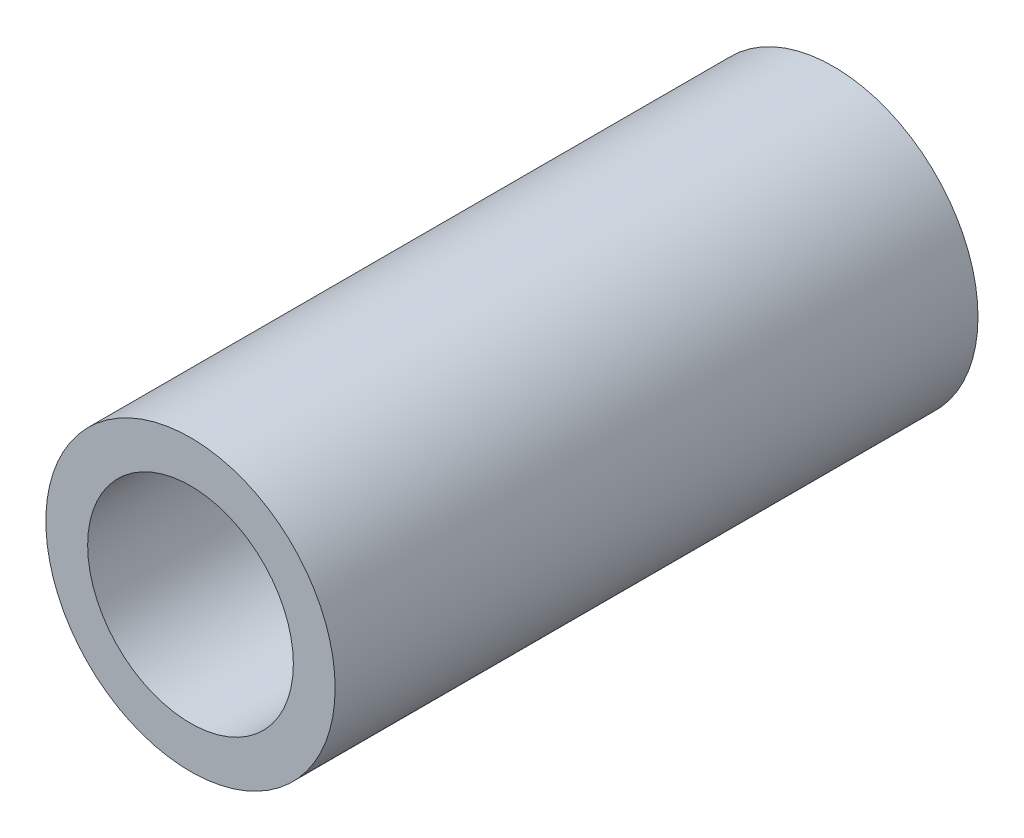
ISO-10303-21;
HEADER;
FILE_DESCRIPTION(('STEP AP214'),'2;1');
FILE_NAME('part.step','',(''),(''),'','','');
FILE_SCHEMA(('AUTOMOTIVE_DESIGN { 1 0 10303 214 1 1 1 1 }'));
ENDSEC;
DATA;
#1=APPLICATION_CONTEXT('core data for automotive mechanical design processes');
#2=APPLICATION_PROTOCOL_DEFINITION('international standard','automotive_design',2000,#1);
#3=PRODUCT_CONTEXT('',#1,'mechanical');
#4=PRODUCT('Part','Part','',(#3));
#5=PRODUCT_RELATED_PRODUCT_CATEGORY('part','',(#4));
#6=PRODUCT_DEFINITION_FORMATION('','',#4);
#7=PRODUCT_DEFINITION_CONTEXT('part definition',#1,'design');
#8=PRODUCT_DEFINITION('design','',#6,#7);
#9=PRODUCT_DEFINITION_SHAPE('','',#8);
#10=(LENGTH_UNIT() NAMED_UNIT(*) SI_UNIT(.MILLI.,.METRE.));
#11=(NAMED_UNIT(*) PLANE_ANGLE_UNIT() SI_UNIT($,.RADIAN.));
#12=(NAMED_UNIT(*) SI_UNIT($,.STERADIAN.) SOLID_ANGLE_UNIT());
#13=UNCERTAINTY_MEASURE_WITH_UNIT(LENGTH_MEASURE(1.E-05),#10,'distance_accuracy_value','');
#14=(GEOMETRIC_REPRESENTATION_CONTEXT(3) GLOBAL_UNCERTAINTY_ASSIGNED_CONTEXT((#13)) GLOBAL_UNIT_ASSIGNED_CONTEXT((#10,
#11,#12)) REPRESENTATION_CONTEXT('',''));
#15=CARTESIAN_POINT('',(0.,0.,0.));
#16=DIRECTION('',(0.,0.,1.));
#17=DIRECTION('',(1.,0.,0.));
#18=AXIS2_PLACEMENT_3D('',#15,#16,#17);
#19=CARTESIAN_POINT('',(0.,0.,5.));
#20=DIRECTION('',(0.,0.,1.));
#21=DIRECTION('',(1.,0.,0.));
#22=AXIS2_PLACEMENT_3D('',#19,#20,#21);
#23=PLANE('',#22);
#24=CARTESIAN_POINT('',(0.,0.,5.));
#25=DIRECTION('',(0.,0.,1.));
#26=DIRECTION('',(1.,0.,0.));
#27=AXIS2_PLACEMENT_3D('',#24,#25,#26);
#28=CIRCLE('',#27,2.25);
#29=CARTESIAN_POINT('',(2.25,0.,5.));
#30=VERTEX_POINT('',#29);
#31=EDGE_CURVE('E10',#30,#30,#28,.T.);
#32=ORIENTED_EDGE('',*,*,#31,.T.);
#33=EDGE_LOOP('',(#32));
#34=FACE_BOUND('',#33,.T.);
#35=CARTESIAN_POINT('',(0.,0.,5.));
#36=DIRECTION('',(0.,0.,1.));
#37=DIRECTION('',(1.,0.,0.));
#38=AXIS2_PLACEMENT_3D('',#35,#36,#37);
#39=CIRCLE('',#38,1.6);
#40=CARTESIAN_POINT('',(1.6,0.,5.));
#41=VERTEX_POINT('',#40);
#42=EDGE_CURVE('E41',#41,#41,#39,.T.);
#43=ORIENTED_EDGE('',*,*,#42,.F.);
#44=EDGE_LOOP('',(#43));
#45=FACE_BOUND('',#44,.T.);
#46=ADVANCED_FACE('F30',(#34,#45),#23,.T.);
#47=CARTESIAN_POINT('',(0.,0.,-5.));
#48=DIRECTION('',(0.,0.,1.));
#49=DIRECTION('',(1.,0.,0.));
#50=AXIS2_PLACEMENT_3D('',#47,#48,#49);
#51=PLANE('',#50);
#52=CARTESIAN_POINT('',(0.,0.,-5.));
#53=DIRECTION('',(0.,0.,1.));
#54=DIRECTION('',(1.,0.,0.));
#55=AXIS2_PLACEMENT_3D('',#52,#53,#54);
#56=CIRCLE('',#55,2.25);
#57=CARTESIAN_POINT('',(2.25,0.,-5.));
#58=VERTEX_POINT('',#57);
#59=EDGE_CURVE('E34',#58,#58,#56,.T.);
#60=ORIENTED_EDGE('',*,*,#59,.F.);
#61=EDGE_LOOP('',(#60));
#62=FACE_BOUND('',#61,.T.);
#63=CARTESIAN_POINT('',(0.,0.,-5.));
#64=DIRECTION('',(0.,0.,1.));
#65=DIRECTION('',(1.,0.,0.));
#66=AXIS2_PLACEMENT_3D('',#63,#64,#65);
#67=CIRCLE('',#66,1.6);
#68=CARTESIAN_POINT('',(1.6,0.,-5.));
#69=VERTEX_POINT('',#68);
#70=EDGE_CURVE('E43',#69,#69,#67,.T.);
#71=ORIENTED_EDGE('',*,*,#70,.T.);
#72=EDGE_LOOP('',(#71));
#73=FACE_BOUND('',#72,.T.);
#74=ADVANCED_FACE('F53',(#62,#73),#51,.F.);
#75=CARTESIAN_POINT('',(0.,0.,5.));
#76=DIRECTION('',(0.,0.,-1.));
#77=DIRECTION('',(-1.,0.,0.));
#78=AXIS2_PLACEMENT_3D('',#75,#76,#77);
#79=CYLINDRICAL_SURFACE('',#78,2.25);
#80=ORIENTED_EDGE('',*,*,#31,.F.);
#81=EDGE_LOOP('',(#80));
#82=FACE_BOUND('',#81,.T.);
#83=ORIENTED_EDGE('',*,*,#59,.T.);
#84=EDGE_LOOP('',(#83));
#85=FACE_BOUND('',#84,.T.);
#86=ADVANCED_FACE('F32',(#82,#85),#79,.T.);
#87=CARTESIAN_POINT('',(0.,0.,5.));
#88=DIRECTION('',(0.,0.,-1.));
#89=DIRECTION('',(-1.,0.,0.));
#90=AXIS2_PLACEMENT_3D('',#87,#88,#89);
#91=CYLINDRICAL_SURFACE('',#90,1.6);
#92=ORIENTED_EDGE('',*,*,#42,.T.);
#93=EDGE_LOOP('',(#92));
#94=FACE_BOUND('',#93,.T.);
#95=ORIENTED_EDGE('',*,*,#70,.F.);
#96=EDGE_LOOP('',(#95));
#97=FACE_BOUND('',#96,.T.);
#98=ADVANCED_FACE('F49',(#94,#97),#91,.F.);
#99=CLOSED_SHELL('',(#46,#74,#86,#98));
#100=MANIFOLD_SOLID_BREP('B2',#99);
#101=ADVANCED_BREP_SHAPE_REPRESENTATION('',(#18,#100),#14);
#102=SHAPE_DEFINITION_REPRESENTATION(#9,#101);
ENDSEC;
END-ISO-10303-21;
